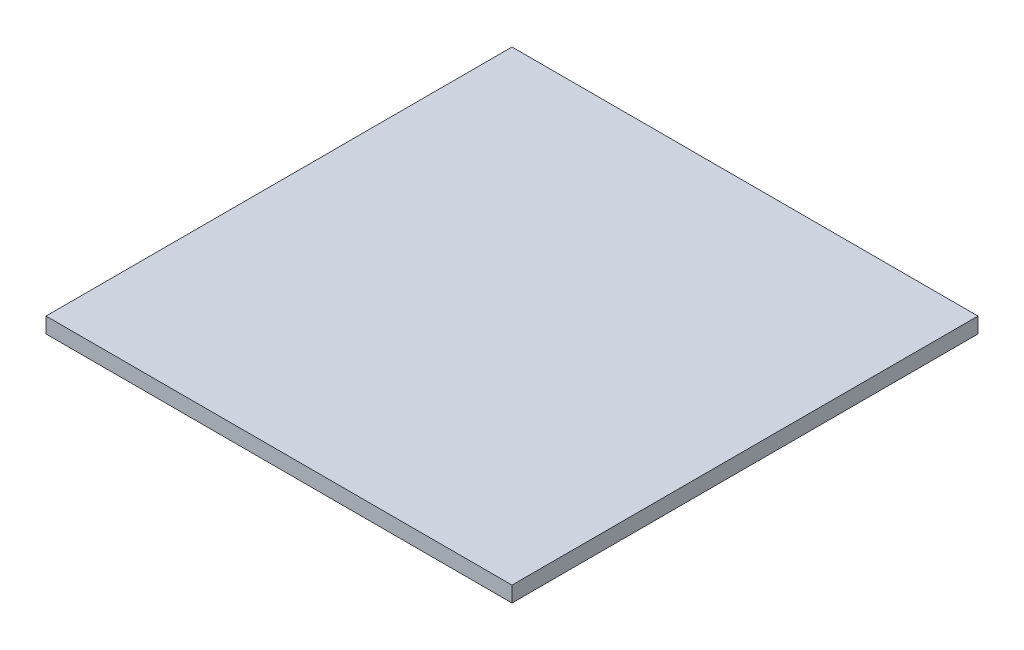
ISO-10303-21;
HEADER;
FILE_DESCRIPTION(('STEP AP214'),'2;1');
FILE_NAME('part.step','',(''),(''),'','','');
FILE_SCHEMA(('AUTOMOTIVE_DESIGN { 1 0 10303 214 1 1 1 1 }'));
ENDSEC;
DATA;
#1=APPLICATION_CONTEXT('core data for automotive mechanical design processes');
#2=APPLICATION_PROTOCOL_DEFINITION('international standard','automotive_design',2000,#1);
#3=PRODUCT_CONTEXT('',#1,'mechanical');
#4=PRODUCT('Part','Part','',(#3));
#5=PRODUCT_RELATED_PRODUCT_CATEGORY('part','',(#4));
#6=PRODUCT_DEFINITION_FORMATION('','',#4);
#7=PRODUCT_DEFINITION_CONTEXT('part definition',#1,'design');
#8=PRODUCT_DEFINITION('design','',#6,#7);
#9=PRODUCT_DEFINITION_SHAPE('','',#8);
#10=(LENGTH_UNIT() NAMED_UNIT(*) SI_UNIT(.MILLI.,.METRE.));
#11=(NAMED_UNIT(*) PLANE_ANGLE_UNIT() SI_UNIT($,.RADIAN.));
#12=(NAMED_UNIT(*) SI_UNIT($,.STERADIAN.) SOLID_ANGLE_UNIT());
#13=UNCERTAINTY_MEASURE_WITH_UNIT(LENGTH_MEASURE(1.E-05),#10,'distance_accuracy_value','');
#14=(GEOMETRIC_REPRESENTATION_CONTEXT(3) GLOBAL_UNCERTAINTY_ASSIGNED_CONTEXT((#13)) GLOBAL_UNIT_ASSIGNED_CONTEXT((#10,
#11,#12)) REPRESENTATION_CONTEXT('',''));
#15=CARTESIAN_POINT('',(0.,0.,0.));
#16=DIRECTION('',(0.,0.,1.));
#17=DIRECTION('',(1.,0.,0.));
#18=AXIS2_PLACEMENT_3D('',#15,#16,#17);
#19=CARTESIAN_POINT('',(0.,1.,0.));
#20=DIRECTION('',(1.,0.,0.));
#21=DIRECTION('',(0.,0.,-1.));
#22=AXIS2_PLACEMENT_3D('',#19,#20,#21);
#23=PLANE('',#22);
#24=DIRECTION('',(0.,0.,1.));
#25=VECTOR('',#24,1.);
#26=CARTESIAN_POINT('',(0.,0.,0.));
#27=LINE('',#26,#25);
#28=CARTESIAN_POINT('',(0.,0.,-30.));
#29=VERTEX_POINT('',#28);
#30=CARTESIAN_POINT('',(0.,0.,0.));
#31=VERTEX_POINT('',#30);
#32=EDGE_CURVE('E96',#29,#31,#27,.T.);
#33=ORIENTED_EDGE('',*,*,#32,.T.);
#34=DIRECTION('',(0.,-1.,0.));
#35=VECTOR('',#34,1.);
#36=CARTESIAN_POINT('',(0.,1.,0.));
#37=LINE('',#36,#35);
#38=CARTESIAN_POINT('',(0.,1.,0.));
#39=VERTEX_POINT('',#38);
#40=EDGE_CURVE('E11',#39,#31,#37,.T.);
#41=ORIENTED_EDGE('',*,*,#40,.F.);
#42=DIRECTION('',(0.,0.,1.));
#43=VECTOR('',#42,1.);
#44=CARTESIAN_POINT('',(0.,1.,0.));
#45=LINE('',#44,#43);
#46=CARTESIAN_POINT('',(0.,1.,-30.));
#47=VERTEX_POINT('',#46);
#48=EDGE_CURVE('E84',#47,#39,#45,.T.);
#49=ORIENTED_EDGE('',*,*,#48,.F.);
#50=DIRECTION('',(0.,-1.,0.));
#51=VECTOR('',#50,1.);
#52=CARTESIAN_POINT('',(0.,1.,-30.));
#53=LINE('',#52,#51);
#54=EDGE_CURVE('E92',#47,#29,#53,.T.);
#55=ORIENTED_EDGE('',*,*,#54,.T.);
#56=EDGE_LOOP('',(#33,#41,#49,#55));
#57=FACE_BOUND('',#56,.T.);
#58=ADVANCED_FACE('F33',(#57),#23,.F.);
#59=CARTESIAN_POINT('',(0.,1.,0.));
#60=DIRECTION('',(0.,0.,-1.));
#61=DIRECTION('',(-1.,0.,0.));
#62=AXIS2_PLACEMENT_3D('',#59,#60,#61);
#63=PLANE('',#62);
#64=DIRECTION('',(1.,0.,0.));
#65=VECTOR('',#64,1.);
#66=CARTESIAN_POINT('',(0.,0.,0.));
#67=LINE('',#66,#65);
#68=CARTESIAN_POINT('',(30.,0.,0.));
#69=VERTEX_POINT('',#68);
#70=EDGE_CURVE('E88',#31,#69,#67,.T.);
#71=ORIENTED_EDGE('',*,*,#70,.T.);
#72=DIRECTION('',(0.,-1.,0.));
#73=VECTOR('',#72,1.);
#74=CARTESIAN_POINT('',(30.,1.,0.));
#75=LINE('',#74,#73);
#76=CARTESIAN_POINT('',(30.,1.,0.));
#77=VERTEX_POINT('',#76);
#78=EDGE_CURVE('E41',#77,#69,#75,.T.);
#79=ORIENTED_EDGE('',*,*,#78,.F.);
#80=DIRECTION('',(1.,0.,0.));
#81=VECTOR('',#80,1.);
#82=CARTESIAN_POINT('',(0.,1.,0.));
#83=LINE('',#82,#81);
#84=EDGE_CURVE('E79',#39,#77,#83,.T.);
#85=ORIENTED_EDGE('',*,*,#84,.F.);
#86=ORIENTED_EDGE('',*,*,#40,.T.);
#87=EDGE_LOOP('',(#71,#79,#85,#86));
#88=FACE_BOUND('',#87,.T.);
#89=ADVANCED_FACE('F87',(#88),#63,.F.);
#90=CARTESIAN_POINT('',(30.,1.,0.));
#91=DIRECTION('',(-1.,0.,0.));
#92=DIRECTION('',(0.,0.,1.));
#93=AXIS2_PLACEMENT_3D('',#90,#91,#92);
#94=PLANE('',#93);
#95=DIRECTION('',(0.,0.,-1.));
#96=VECTOR('',#95,1.);
#97=CARTESIAN_POINT('',(30.,0.,0.));
#98=LINE('',#97,#96);
#99=CARTESIAN_POINT('',(30.,0.,-30.));
#100=VERTEX_POINT('',#99);
#101=EDGE_CURVE('E66',#69,#100,#98,.T.);
#102=ORIENTED_EDGE('',*,*,#101,.T.);
#103=DIRECTION('',(0.,-1.,0.));
#104=VECTOR('',#103,1.);
#105=CARTESIAN_POINT('',(30.,1.,-30.));
#106=LINE('',#105,#104);
#107=CARTESIAN_POINT('',(30.,1.,-30.));
#108=VERTEX_POINT('',#107);
#109=EDGE_CURVE('E89',#108,#100,#106,.T.);
#110=ORIENTED_EDGE('',*,*,#109,.F.);
#111=DIRECTION('',(0.,0.,-1.));
#112=VECTOR('',#111,1.);
#113=CARTESIAN_POINT('',(30.,1.,0.));
#114=LINE('',#113,#112);
#115=EDGE_CURVE('E82',#77,#108,#114,.T.);
#116=ORIENTED_EDGE('',*,*,#115,.F.);
#117=ORIENTED_EDGE('',*,*,#78,.T.);
#118=EDGE_LOOP('',(#102,#110,#116,#117));
#119=FACE_BOUND('',#118,.T.);
#120=ADVANCED_FACE('F90',(#119),#94,.F.);
#121=CARTESIAN_POINT('',(0.,1.,-30.));
#122=DIRECTION('',(0.,0.,1.));
#123=DIRECTION('',(1.,0.,0.));
#124=AXIS2_PLACEMENT_3D('',#121,#122,#123);
#125=PLANE('',#124);
#126=DIRECTION('',(-1.,0.,0.));
#127=VECTOR('',#126,1.);
#128=CARTESIAN_POINT('',(0.,0.,-30.));
#129=LINE('',#128,#127);
#130=EDGE_CURVE('E72',#100,#29,#129,.T.);
#131=ORIENTED_EDGE('',*,*,#130,.T.);
#132=ORIENTED_EDGE('',*,*,#54,.F.);
#133=DIRECTION('',(-1.,0.,0.));
#134=VECTOR('',#133,1.);
#135=CARTESIAN_POINT('',(0.,1.,-30.));
#136=LINE('',#135,#134);
#137=EDGE_CURVE('E49',#108,#47,#136,.T.);
#138=ORIENTED_EDGE('',*,*,#137,.F.);
#139=ORIENTED_EDGE('',*,*,#109,.T.);
#140=EDGE_LOOP('',(#131,#132,#138,#139));
#141=FACE_BOUND('',#140,.T.);
#142=ADVANCED_FACE('F103',(#141),#125,.F.);
#143=CARTESIAN_POINT('',(0.,1.,0.));
#144=DIRECTION('',(0.,-1.,0.));
#145=DIRECTION('',(0.,0.,-1.));
#146=AXIS2_PLACEMENT_3D('',#143,#144,#145);
#147=PLANE('',#146);
#148=ORIENTED_EDGE('',*,*,#48,.T.);
#149=ORIENTED_EDGE('',*,*,#84,.T.);
#150=ORIENTED_EDGE('',*,*,#115,.T.);
#151=ORIENTED_EDGE('',*,*,#137,.T.);
#152=EDGE_LOOP('',(#148,#149,#150,#151));
#153=FACE_BOUND('',#152,.T.);
#154=ADVANCED_FACE('F80',(#153),#147,.F.);
#155=CARTESIAN_POINT('',(0.,0.,0.));
#156=DIRECTION('',(0.,-1.,0.));
#157=DIRECTION('',(0.,0.,-1.));
#158=AXIS2_PLACEMENT_3D('',#155,#156,#157);
#159=PLANE('',#158);
#160=ORIENTED_EDGE('',*,*,#32,.F.);
#161=ORIENTED_EDGE('',*,*,#130,.F.);
#162=ORIENTED_EDGE('',*,*,#101,.F.);
#163=ORIENTED_EDGE('',*,*,#70,.F.);
#164=EDGE_LOOP('',(#160,#161,#162,#163));
#165=FACE_BOUND('',#164,.T.);
#166=ADVANCED_FACE('F106',(#165),#159,.T.);
#167=CLOSED_SHELL('',(#58,#89,#120,#142,#154,#166));
#168=MANIFOLD_SOLID_BREP('B2',#167);
#169=ADVANCED_BREP_SHAPE_REPRESENTATION('',(#18,#168),#14);
#170=SHAPE_DEFINITION_REPRESENTATION(#9,#169);
ENDSEC;
END-ISO-10303-21;
